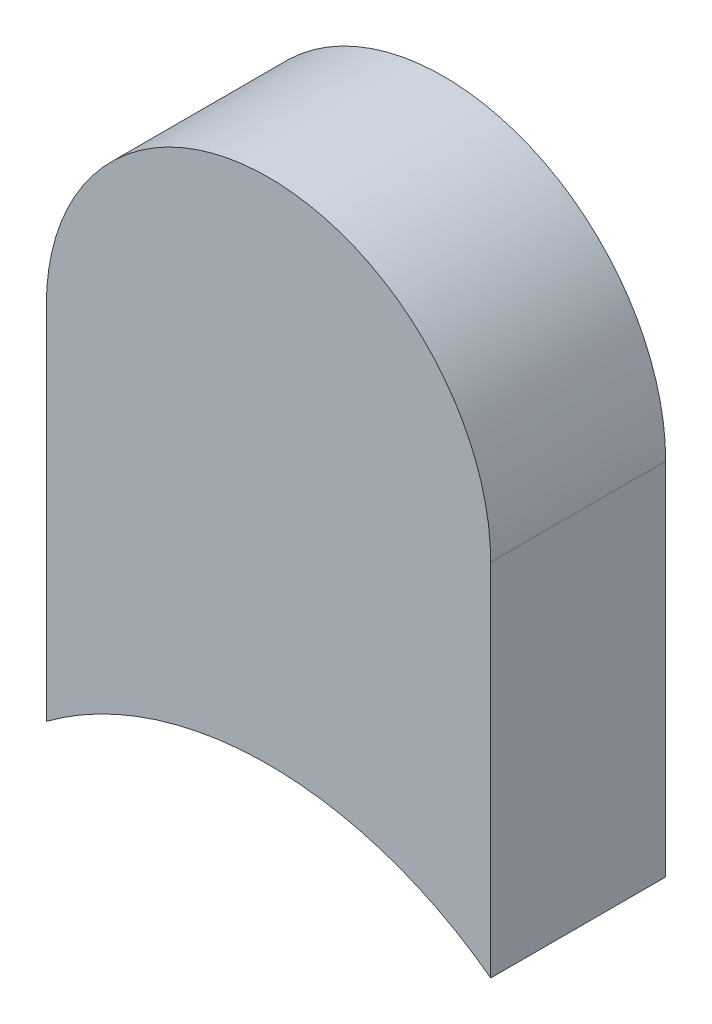
ISO-10303-21;
HEADER;
FILE_DESCRIPTION(('STEP AP214'),'2;1');
FILE_NAME('part.step','',(''),(''),'','','');
FILE_SCHEMA(('AUTOMOTIVE_DESIGN { 1 0 10303 214 1 1 1 1 }'));
ENDSEC;
DATA;
#1=APPLICATION_CONTEXT('core data for automotive mechanical design processes');
#2=APPLICATION_PROTOCOL_DEFINITION('international standard','automotive_design',2000,#1);
#3=PRODUCT_CONTEXT('',#1,'mechanical');
#4=PRODUCT('Part','Part','',(#3));
#5=PRODUCT_RELATED_PRODUCT_CATEGORY('part','',(#4));
#6=PRODUCT_DEFINITION_FORMATION('','',#4);
#7=PRODUCT_DEFINITION_CONTEXT('part definition',#1,'design');
#8=PRODUCT_DEFINITION('design','',#6,#7);
#9=PRODUCT_DEFINITION_SHAPE('','',#8);
#10=(LENGTH_UNIT() NAMED_UNIT(*) SI_UNIT(.MILLI.,.METRE.));
#11=(NAMED_UNIT(*) PLANE_ANGLE_UNIT() SI_UNIT($,.RADIAN.));
#12=(NAMED_UNIT(*) SI_UNIT($,.STERADIAN.) SOLID_ANGLE_UNIT());
#13=UNCERTAINTY_MEASURE_WITH_UNIT(LENGTH_MEASURE(1.E-05),#10,'distance_accuracy_value','');
#14=(GEOMETRIC_REPRESENTATION_CONTEXT(3) GLOBAL_UNCERTAINTY_ASSIGNED_CONTEXT((#13)) GLOBAL_UNIT_ASSIGNED_CONTEXT((#10,
#11,#12)) REPRESENTATION_CONTEXT('',''));
#15=CARTESIAN_POINT('',(0.,0.,0.));
#16=DIRECTION('',(0.,0.,1.));
#17=DIRECTION('',(1.,0.,0.));
#18=AXIS2_PLACEMENT_3D('',#15,#16,#17);
#19=CARTESIAN_POINT('',(107.823,118.892149431103,0.));
#20=DIRECTION('',(-1.,0.,0.));
#21=DIRECTION('',(0.,1.,0.));
#22=AXIS2_PLACEMENT_3D('',#19,#20,#21);
#23=PLANE('',#22);
#24=DIRECTION('',(0.,1.,0.));
#25=VECTOR('',#24,1.);
#26=CARTESIAN_POINT('',(107.823,118.5514012,0.1999996));
#27=LINE('',#26,#25);
#28=CARTESIAN_POINT('',(107.823,118.892149431103,0.1999996));
#29=VERTEX_POINT('',#28);
#30=CARTESIAN_POINT('',(107.823,119.3038,0.1999996));
#31=VERTEX_POINT('',#30);
#32=EDGE_CURVE('E11',#29,#31,#27,.T.);
#33=ORIENTED_EDGE('',*,*,#32,.F.);
#34=DIRECTION('',(0.,0.,1.));
#35=VECTOR('',#34,1.);
#36=CARTESIAN_POINT('',(107.823,118.892149431103,0.));
#37=LINE('',#36,#35);
#38=CARTESIAN_POINT('',(107.823,118.892149431103,0.));
#39=VERTEX_POINT('',#38);
#40=EDGE_CURVE('E24',#39,#29,#37,.T.);
#41=ORIENTED_EDGE('',*,*,#40,.F.);
#42=DIRECTION('',(0.,1.,0.));
#43=VECTOR('',#42,1.);
#44=CARTESIAN_POINT('',(107.823,118.5514012,0.));
#45=LINE('',#44,#43);
#46=CARTESIAN_POINT('',(107.823,119.3038,0.));
#47=VERTEX_POINT('',#46);
#48=EDGE_CURVE('E75',#39,#47,#45,.T.);
#49=ORIENTED_EDGE('',*,*,#48,.T.);
#50=DIRECTION('',(0.,0.,1.));
#51=VECTOR('',#50,1.);
#52=CARTESIAN_POINT('',(107.823,119.3038,0.));
#53=LINE('',#52,#51);
#54=EDGE_CURVE('E37',#47,#31,#53,.T.);
#55=ORIENTED_EDGE('',*,*,#54,.T.);
#56=EDGE_LOOP('',(#33,#41,#49,#55));
#57=FACE_BOUND('',#56,.T.);
#58=ADVANCED_FACE('F17',(#57),#23,.F.);
#59=CARTESIAN_POINT('',(107.569,119.3038,0.));
#60=DIRECTION('',(0.,0.,-1.));
#61=DIRECTION('',(1.,0.,0.));
#62=AXIS2_PLACEMENT_3D('',#59,#60,#61);
#63=CYLINDRICAL_SURFACE('',#62,0.253999999999995);
#64=CARTESIAN_POINT('',(107.569,119.3038,0.1999996));
#65=DIRECTION('',(0.,0.,1.));
#66=DIRECTION('',(1.,0.,0.));
#67=AXIS2_PLACEMENT_3D('',#64,#65,#66);
#68=CIRCLE('',#67,0.253999999999995);
#69=CARTESIAN_POINT('',(107.315,119.3038,0.1999996));
#70=VERTEX_POINT('',#69);
#71=EDGE_CURVE('E83',#31,#70,#68,.T.);
#72=ORIENTED_EDGE('',*,*,#71,.F.);
#73=ORIENTED_EDGE('',*,*,#54,.F.);
#74=CARTESIAN_POINT('',(107.569,119.3038,0.));
#75=DIRECTION('',(0.,0.,1.));
#76=DIRECTION('',(1.,0.,0.));
#77=AXIS2_PLACEMENT_3D('',#74,#75,#76);
#78=CIRCLE('',#77,0.253999999999995);
#79=CARTESIAN_POINT('',(107.315,119.3038,0.));
#80=VERTEX_POINT('',#79);
#81=EDGE_CURVE('E81',#47,#80,#78,.T.);
#82=ORIENTED_EDGE('',*,*,#81,.T.);
#83=DIRECTION('',(0.,0.,1.));
#84=VECTOR('',#83,1.);
#85=CARTESIAN_POINT('',(107.315,119.3038,0.));
#86=LINE('',#85,#84);
#87=EDGE_CURVE('E67',#80,#70,#86,.T.);
#88=ORIENTED_EDGE('',*,*,#87,.T.);
#89=EDGE_LOOP('',(#72,#73,#82,#88));
#90=FACE_BOUND('',#89,.T.);
#91=ADVANCED_FACE('F89',(#90),#63,.T.);
#92=CARTESIAN_POINT('',(107.315,119.3038,0.));
#93=DIRECTION('',(1.,0.,0.));
#94=DIRECTION('',(0.,-1.,0.));
#95=AXIS2_PLACEMENT_3D('',#92,#93,#94);
#96=PLANE('',#95);
#97=DIRECTION('',(0.,-1.,0.));
#98=VECTOR('',#97,1.);
#99=CARTESIAN_POINT('',(107.315,119.3038,0.1999996));
#100=LINE('',#99,#98);
#101=CARTESIAN_POINT('',(107.315,118.892149431103,0.1999996));
#102=VERTEX_POINT('',#101);
#103=EDGE_CURVE('E71',#70,#102,#100,.T.);
#104=ORIENTED_EDGE('',*,*,#103,.F.);
#105=ORIENTED_EDGE('',*,*,#87,.F.);
#106=DIRECTION('',(0.,-1.,0.));
#107=VECTOR('',#106,1.);
#108=CARTESIAN_POINT('',(107.315,119.3038,0.));
#109=LINE('',#108,#107);
#110=CARTESIAN_POINT('',(107.315,118.892149431103,0.));
#111=VERTEX_POINT('',#110);
#112=EDGE_CURVE('E63',#80,#111,#109,.T.);
#113=ORIENTED_EDGE('',*,*,#112,.T.);
#114=DIRECTION('',(0.,0.,1.));
#115=VECTOR('',#114,1.);
#116=CARTESIAN_POINT('',(107.315,118.892149431103,0.));
#117=LINE('',#116,#115);
#118=EDGE_CURVE('E53',#111,#102,#117,.T.);
#119=ORIENTED_EDGE('',*,*,#118,.T.);
#120=EDGE_LOOP('',(#104,#105,#113,#119));
#121=FACE_BOUND('',#120,.T.);
#122=ADVANCED_FACE('F66',(#121),#96,.F.);
#123=CARTESIAN_POINT('',(107.569,118.5514012,0.));
#124=DIRECTION('',(0.,0.,-1.));
#125=DIRECTION('',(1.,0.,0.));
#126=AXIS2_PLACEMENT_3D('',#123,#124,#125);
#127=CYLINDRICAL_SURFACE('',#126,0.42500042);
#128=ORIENTED_EDGE('',*,*,#40,.T.);
#129=CARTESIAN_POINT('',(107.569,118.5514012,0.1999996));
#130=DIRECTION('',(0.,0.,1.));
#131=DIRECTION('',(1.,0.,0.));
#132=AXIS2_PLACEMENT_3D('',#129,#130,#131);
#133=CIRCLE('',#132,0.42500042);
#134=EDGE_CURVE('E59',#29,#102,#133,.T.);
#135=ORIENTED_EDGE('',*,*,#134,.T.);
#136=ORIENTED_EDGE('',*,*,#118,.F.);
#137=CARTESIAN_POINT('',(107.569,118.5514012,0.));
#138=DIRECTION('',(0.,0.,1.));
#139=DIRECTION('',(1.,0.,0.));
#140=AXIS2_PLACEMENT_3D('',#137,#138,#139);
#141=CIRCLE('',#140,0.42500042);
#142=EDGE_CURVE('E57',#39,#111,#141,.T.);
#143=ORIENTED_EDGE('',*,*,#142,.F.);
#144=EDGE_LOOP('',(#128,#135,#136,#143));
#145=FACE_BOUND('',#144,.T.);
#146=ADVANCED_FACE('F55',(#145),#127,.F.);
#147=CARTESIAN_POINT('',(107.823,118.5514012,0.));
#148=DIRECTION('',(0.,0.,-1.));
#149=DIRECTION('',(-1.,0.,0.));
#150=AXIS2_PLACEMENT_3D('',#147,#148,#149);
#151=PLANE('',#150);
#152=ORIENTED_EDGE('',*,*,#48,.F.);
#153=ORIENTED_EDGE('',*,*,#142,.T.);
#154=ORIENTED_EDGE('',*,*,#112,.F.);
#155=ORIENTED_EDGE('',*,*,#81,.F.);
#156=EDGE_LOOP('',(#152,#153,#154,#155));
#157=FACE_BOUND('',#156,.T.);
#158=ADVANCED_FACE('F74',(#157),#151,.T.);
#159=CARTESIAN_POINT('',(107.823,118.5514012,0.1999996));
#160=DIRECTION('',(0.,0.,-1.));
#161=DIRECTION('',(-1.,0.,0.));
#162=AXIS2_PLACEMENT_3D('',#159,#160,#161);
#163=PLANE('',#162);
#164=ORIENTED_EDGE('',*,*,#134,.F.);
#165=ORIENTED_EDGE('',*,*,#32,.T.);
#166=ORIENTED_EDGE('',*,*,#71,.T.);
#167=ORIENTED_EDGE('',*,*,#103,.T.);
#168=EDGE_LOOP('',(#164,#165,#166,#167));
#169=FACE_BOUND('',#168,.T.);
#170=ADVANCED_FACE('F91',(#169),#163,.F.);
#171=CLOSED_SHELL('',(#58,#91,#122,#146,#158,#170));
#172=MANIFOLD_SOLID_BREP('B1',#171);
#173=ADVANCED_BREP_SHAPE_REPRESENTATION('',(#18,#172),#14);
#174=SHAPE_DEFINITION_REPRESENTATION(#9,#173);
ENDSEC;
END-ISO-10303-21;
